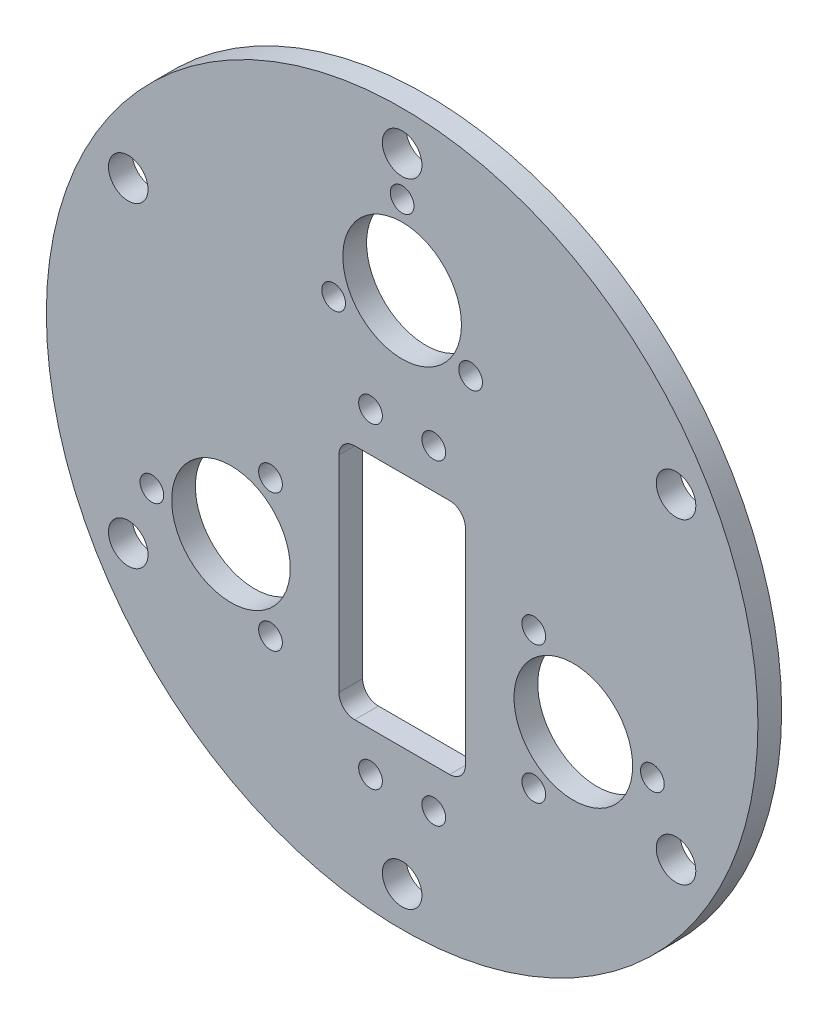
ISO-10303-21;
HEADER;
FILE_DESCRIPTION(('STEP AP214'),'2;1');
FILE_NAME('part.step','',(''),(''),'','','');
FILE_SCHEMA(('AUTOMOTIVE_DESIGN { 1 0 10303 214 1 1 1 1 }'));
ENDSEC;
DATA;
#1=APPLICATION_CONTEXT('core data for automotive mechanical design processes');
#2=APPLICATION_PROTOCOL_DEFINITION('international standard','automotive_design',2000,#1);
#3=PRODUCT_CONTEXT('',#1,'mechanical');
#4=PRODUCT('Part','Part','',(#3));
#5=PRODUCT_RELATED_PRODUCT_CATEGORY('part','',(#4));
#6=PRODUCT_DEFINITION_FORMATION('','',#4);
#7=PRODUCT_DEFINITION_CONTEXT('part definition',#1,'design');
#8=PRODUCT_DEFINITION('design','',#6,#7);
#9=PRODUCT_DEFINITION_SHAPE('','',#8);
#10=(LENGTH_UNIT() NAMED_UNIT(*) SI_UNIT(.MILLI.,.METRE.));
#11=(NAMED_UNIT(*) PLANE_ANGLE_UNIT() SI_UNIT($,.RADIAN.));
#12=(NAMED_UNIT(*) SI_UNIT($,.STERADIAN.) SOLID_ANGLE_UNIT());
#13=UNCERTAINTY_MEASURE_WITH_UNIT(LENGTH_MEASURE(1.E-05),#10,'distance_accuracy_value','');
#14=(GEOMETRIC_REPRESENTATION_CONTEXT(3) GLOBAL_UNCERTAINTY_ASSIGNED_CONTEXT((#13)) GLOBAL_UNIT_ASSIGNED_CONTEXT((#10,
#11,#12)) REPRESENTATION_CONTEXT('',''));
#15=CARTESIAN_POINT('',(0.,0.,0.));
#16=DIRECTION('',(0.,0.,1.));
#17=DIRECTION('',(1.,0.,0.));
#18=AXIS2_PLACEMENT_3D('',#15,#16,#17);
#19=CARTESIAN_POINT('',(0.,0.,0.3));
#20=DIRECTION('',(0.,0.,1.));
#21=DIRECTION('',(1.,0.,0.));
#22=AXIS2_PLACEMENT_3D('',#19,#20,#21);
#23=PLANE('',#22);
#24=CARTESIAN_POINT('',(-0.4,1.,0.3));
#25=DIRECTION('',(0.,0.,1.));
#26=DIRECTION('',(1.,0.,0.));
#27=AXIS2_PLACEMENT_3D('',#24,#25,#26);
#28=CIRCLE('',#27,0.15);
#29=CARTESIAN_POINT('',(-0.25,1.,0.3));
#30=VERTEX_POINT('',#29);
#31=EDGE_CURVE('E384',#30,#30,#28,.T.);
#32=ORIENTED_EDGE('',*,*,#31,.F.);
#33=EDGE_LOOP('',(#32));
#34=FACE_BOUND('',#33,.T.);
#35=CARTESIAN_POINT('',(0.4,1.,0.3));
#36=DIRECTION('',(0.,0.,1.));
#37=DIRECTION('',(1.,0.,0.));
#38=AXIS2_PLACEMENT_3D('',#35,#36,#37);
#39=CIRCLE('',#38,0.15);
#40=CARTESIAN_POINT('',(0.549999999999999,1.,0.3));
#41=VERTEX_POINT('',#40);
#42=EDGE_CURVE('E386',#41,#41,#39,.T.);
#43=ORIENTED_EDGE('',*,*,#42,.F.);
#44=EDGE_LOOP('',(#43));
#45=FACE_BOUND('',#44,.T.);
#46=CARTESIAN_POINT('',(-0.4,-3.,0.3));
#47=DIRECTION('',(0.,0.,1.));
#48=DIRECTION('',(1.,0.,0.));
#49=AXIS2_PLACEMENT_3D('',#46,#47,#48);
#50=CIRCLE('',#49,0.15);
#51=CARTESIAN_POINT('',(-0.25,-3.,0.3));
#52=VERTEX_POINT('',#51);
#53=EDGE_CURVE('E392',#52,#52,#50,.T.);
#54=ORIENTED_EDGE('',*,*,#53,.F.);
#55=EDGE_LOOP('',(#54));
#56=FACE_BOUND('',#55,.T.);
#57=CARTESIAN_POINT('',(0.4,-3.,0.3));
#58=DIRECTION('',(0.,0.,1.));
#59=DIRECTION('',(1.,0.,0.));
#60=AXIS2_PLACEMENT_3D('',#57,#58,#59);
#61=CIRCLE('',#60,0.15);
#62=CARTESIAN_POINT('',(0.55,-3.,0.3));
#63=VERTEX_POINT('',#62);
#64=EDGE_CURVE('E398',#63,#63,#61,.T.);
#65=ORIENTED_EDGE('',*,*,#64,.F.);
#66=EDGE_LOOP('',(#65));
#67=FACE_BOUND('',#66,.T.);
#68=CARTESIAN_POINT('',(-1.66506350946094,-0.383974596215649,0.3));
#69=DIRECTION('',(0.,0.,1.));
#70=DIRECTION('',(-0.499999999999992,-0.866025403784443,0.));
#71=AXIS2_PLACEMENT_3D('',#68,#69,#70);
#72=CIRCLE('',#71,0.15);
#73=CARTESIAN_POINT('',(-1.74006350946094,-0.513878406783316,0.3));
#74=VERTEX_POINT('',#73);
#75=EDGE_CURVE('E404',#74,#74,#72,.T.);
#76=ORIENTED_EDGE('',*,*,#75,.F.);
#77=EDGE_LOOP('',(#76));
#78=FACE_BOUND('',#77,.T.);
#79=CARTESIAN_POINT('',(-1.66506350946093,-2.11602540378453,0.3));
#80=DIRECTION('',(0.,0.,1.));
#81=DIRECTION('',(-0.500000000000004,0.866025403784436,0.));
#82=AXIS2_PLACEMENT_3D('',#79,#80,#81);
#83=CIRCLE('',#82,0.15);
#84=CARTESIAN_POINT('',(-1.74006350946093,-1.98612159321686,0.3));
#85=VERTEX_POINT('',#84);
#86=EDGE_CURVE('E410',#85,#85,#83,.T.);
#87=ORIENTED_EDGE('',*,*,#86,.F.);
#88=EDGE_LOOP('',(#87));
#89=FACE_BOUND('',#88,.T.);
#90=CARTESIAN_POINT('',(-3.16506350946094,-1.25000000000009,0.3));
#91=DIRECTION('',(0.,0.,1.));
#92=DIRECTION('',(1.,0.,0.));
#93=AXIS2_PLACEMENT_3D('',#90,#91,#92);
#94=CIRCLE('',#93,0.15);
#95=CARTESIAN_POINT('',(-3.01506350946094,-1.25000000000009,0.3));
#96=VERTEX_POINT('',#95);
#97=EDGE_CURVE('E416',#96,#96,#94,.T.);
#98=ORIENTED_EDGE('',*,*,#97,.F.);
#99=EDGE_LOOP('',(#98));
#100=FACE_BOUND('',#99,.T.);
#101=CARTESIAN_POINT('',(1.66506350946127,-2.11602540378435,0.3));
#102=DIRECTION('',(0.,0.,1.));
#103=DIRECTION('',(-0.499999999999992,-0.866025403784443,0.));
#104=AXIS2_PLACEMENT_3D('',#101,#102,#103);
#105=CIRCLE('',#104,0.15);
#106=CARTESIAN_POINT('',(1.59006350946127,-2.24592921435202,0.3));
#107=VERTEX_POINT('',#106);
#108=EDGE_CURVE('E422',#107,#107,#105,.T.);
#109=ORIENTED_EDGE('',*,*,#108,.F.);
#110=EDGE_LOOP('',(#109));
#111=FACE_BOUND('',#110,.T.);
#112=CARTESIAN_POINT('',(1.66506350946125,-0.383974596215471,0.3));
#113=DIRECTION('',(0.,0.,1.));
#114=DIRECTION('',(-0.500000000000004,0.866025403784436,0.));
#115=AXIS2_PLACEMENT_3D('',#112,#113,#114);
#116=CIRCLE('',#115,0.15);
#117=CARTESIAN_POINT('',(1.59006350946125,-0.254070785647806,0.3));
#118=VERTEX_POINT('',#117);
#119=EDGE_CURVE('E428',#118,#118,#116,.T.);
#120=ORIENTED_EDGE('',*,*,#119,.F.);
#121=EDGE_LOOP('',(#120));
#122=FACE_BOUND('',#121,.T.);
#123=CARTESIAN_POINT('',(3.16506350946126,-1.24999999999991,0.3));
#124=DIRECTION('',(0.,0.,1.));
#125=DIRECTION('',(1.,0.,0.));
#126=AXIS2_PLACEMENT_3D('',#123,#124,#125);
#127=CIRCLE('',#126,0.15);
#128=CARTESIAN_POINT('',(3.31506350946126,-1.24999999999991,0.3));
#129=VERTEX_POINT('',#128);
#130=EDGE_CURVE('E434',#129,#129,#127,.T.);
#131=ORIENTED_EDGE('',*,*,#130,.F.);
#132=EDGE_LOOP('',(#131));
#133=FACE_BOUND('',#132,.T.);
#134=CARTESIAN_POINT('',(0.866025403784441,2.,0.3));
#135=DIRECTION('',(0.,0.,1.));
#136=DIRECTION('',(-0.499999999999997,-0.866025403784441,0.));
#137=AXIS2_PLACEMENT_3D('',#134,#135,#136);
#138=CIRCLE('',#137,0.15);
#139=CARTESIAN_POINT('',(0.791025403784441,1.87009618943234,0.3));
#140=VERTEX_POINT('',#139);
#141=EDGE_CURVE('E440',#140,#140,#138,.T.);
#142=ORIENTED_EDGE('',*,*,#141,.F.);
#143=EDGE_LOOP('',(#142));
#144=FACE_BOUND('',#143,.T.);
#145=CARTESIAN_POINT('',(-0.866025403784438,2.,0.3));
#146=DIRECTION('',(0.,0.,1.));
#147=DIRECTION('',(-0.500000000000002,0.866025403784438,0.));
#148=AXIS2_PLACEMENT_3D('',#145,#146,#147);
#149=CIRCLE('',#148,0.15);
#150=CARTESIAN_POINT('',(-0.941025403784438,2.12990381056766,0.3));
#151=VERTEX_POINT('',#150);
#152=EDGE_CURVE('E446',#151,#151,#149,.T.);
#153=ORIENTED_EDGE('',*,*,#152,.F.);
#154=EDGE_LOOP('',(#153));
#155=FACE_BOUND('',#154,.T.);
#156=CARTESIAN_POINT('',(0.,3.5,0.3));
#157=DIRECTION('',(0.,0.,1.));
#158=DIRECTION('',(1.,0.,0.));
#159=AXIS2_PLACEMENT_3D('',#156,#157,#158);
#160=CIRCLE('',#159,0.15);
#161=CARTESIAN_POINT('',(0.15,3.5,0.3));
#162=VERTEX_POINT('',#161);
#163=EDGE_CURVE('E452',#162,#162,#160,.T.);
#164=ORIENTED_EDGE('',*,*,#163,.F.);
#165=EDGE_LOOP('',(#164));
#166=FACE_BOUND('',#165,.T.);
#167=DIRECTION('',(-1.,0.,0.));
#168=VECTOR('',#167,1.);
#169=CARTESIAN_POINT('',(-0.8,0.5,0.3));
#170=LINE('',#169,#168);
#171=CARTESIAN_POINT('',(0.6,0.5,0.3));
#172=VERTEX_POINT('',#171);
#173=CARTESIAN_POINT('',(-0.6,0.5,0.3));
#174=VERTEX_POINT('',#173);
#175=EDGE_CURVE('E134',#172,#174,#170,.T.);
#176=ORIENTED_EDGE('',*,*,#175,.F.);
#177=CARTESIAN_POINT('',(0.6,0.3,0.3));
#178=DIRECTION('',(0.,0.,1.));
#179=DIRECTION('',(1.,0.,0.));
#180=AXIS2_PLACEMENT_3D('',#177,#178,#179);
#181=CIRCLE('',#180,0.2);
#182=CARTESIAN_POINT('',(0.8,0.3,0.3));
#183=VERTEX_POINT('',#182);
#184=EDGE_CURVE('E215',#172,#183,#181,.F.);
#185=ORIENTED_EDGE('',*,*,#184,.T.);
#186=DIRECTION('',(0.,1.,0.));
#187=VECTOR('',#186,1.);
#188=CARTESIAN_POINT('',(0.8,0.5,0.3));
#189=LINE('',#188,#187);
#190=CARTESIAN_POINT('',(0.8,-2.3,0.3));
#191=VERTEX_POINT('',#190);
#192=EDGE_CURVE('E128',#191,#183,#189,.T.);
#193=ORIENTED_EDGE('',*,*,#192,.F.);
#194=CARTESIAN_POINT('',(0.6,-2.3,0.3));
#195=DIRECTION('',(0.,0.,1.));
#196=DIRECTION('',(1.,0.,0.));
#197=AXIS2_PLACEMENT_3D('',#194,#195,#196);
#198=CIRCLE('',#197,0.2);
#199=CARTESIAN_POINT('',(0.6,-2.5,0.3));
#200=VERTEX_POINT('',#199);
#201=EDGE_CURVE('E127',#191,#200,#198,.F.);
#202=ORIENTED_EDGE('',*,*,#201,.T.);
#203=DIRECTION('',(1.,0.,0.));
#204=VECTOR('',#203,1.);
#205=CARTESIAN_POINT('',(-0.8,-2.5,0.3));
#206=LINE('',#205,#204);
#207=CARTESIAN_POINT('',(-0.6,-2.5,0.3));
#208=VERTEX_POINT('',#207);
#209=EDGE_CURVE('E117',#208,#200,#206,.T.);
#210=ORIENTED_EDGE('',*,*,#209,.F.);
#211=CARTESIAN_POINT('',(-0.6,-2.3,0.3));
#212=DIRECTION('',(0.,0.,1.));
#213=DIRECTION('',(1.,0.,0.));
#214=AXIS2_PLACEMENT_3D('',#211,#212,#213);
#215=CIRCLE('',#214,0.2);
#216=CARTESIAN_POINT('',(-0.8,-2.3,0.3));
#217=VERTEX_POINT('',#216);
#218=EDGE_CURVE('E100',#208,#217,#215,.F.);
#219=ORIENTED_EDGE('',*,*,#218,.T.);
#220=DIRECTION('',(0.,-1.,0.));
#221=VECTOR('',#220,1.);
#222=CARTESIAN_POINT('',(-0.8,0.5,0.3));
#223=LINE('',#222,#221);
#224=CARTESIAN_POINT('',(-0.8,0.3,0.3));
#225=VERTEX_POINT('',#224);
#226=EDGE_CURVE('E129',#225,#217,#223,.T.);
#227=ORIENTED_EDGE('',*,*,#226,.F.);
#228=CARTESIAN_POINT('',(-0.6,0.3,0.3));
#229=DIRECTION('',(0.,0.,1.));
#230=DIRECTION('',(1.,0.,0.));
#231=AXIS2_PLACEMENT_3D('',#228,#229,#230);
#232=CIRCLE('',#231,0.2);
#233=EDGE_CURVE('E42',#225,#174,#232,.F.);
#234=ORIENTED_EDGE('',*,*,#233,.T.);
#235=EDGE_LOOP('',(#176,#185,#193,#202,#210,#219,#227,#234));
#236=FACE_BOUND('',#235,.T.);
#237=CARTESIAN_POINT('',(3.46410161513773,-2.00000000000004,0.3));
#238=DIRECTION('',(0.,0.,1.));
#239=DIRECTION('',(1.,0.,0.));
#240=AXIS2_PLACEMENT_3D('',#237,#238,#239);
#241=CIRCLE('',#240,0.25);
#242=CARTESIAN_POINT('',(3.71410161513773,-2.00000000000004,0.3));
#243=VERTEX_POINT('',#242);
#244=EDGE_CURVE('E142',#243,#243,#241,.T.);
#245=ORIENTED_EDGE('',*,*,#244,.F.);
#246=EDGE_LOOP('',(#245));
#247=FACE_BOUND('',#246,.T.);
#248=CARTESIAN_POINT('',(3.46410161513777,1.99999999999997,0.3));
#249=DIRECTION('',(0.,0.,1.));
#250=DIRECTION('',(1.,0.,0.));
#251=AXIS2_PLACEMENT_3D('',#248,#249,#250);
#252=CIRCLE('',#251,0.25);
#253=CARTESIAN_POINT('',(3.71410161513777,1.99999999999997,0.3));
#254=VERTEX_POINT('',#253);
#255=EDGE_CURVE('E141',#254,#254,#252,.T.);
#256=ORIENTED_EDGE('',*,*,#255,.F.);
#257=EDGE_LOOP('',(#256));
#258=FACE_BOUND('',#257,.T.);
#259=CARTESIAN_POINT('',(0.,4.,0.3));
#260=DIRECTION('',(0.,0.,1.));
#261=DIRECTION('',(1.,0.,0.));
#262=AXIS2_PLACEMENT_3D('',#259,#260,#261);
#263=CIRCLE('',#262,0.25);
#264=CARTESIAN_POINT('',(0.250000000000028,4.,0.3));
#265=VERTEX_POINT('',#264);
#266=EDGE_CURVE('E149',#265,#265,#263,.T.);
#267=ORIENTED_EDGE('',*,*,#266,.F.);
#268=EDGE_LOOP('',(#267));
#269=FACE_BOUND('',#268,.T.);
#270=CARTESIAN_POINT('',(-3.46410161513775,2.00000000000002,0.3));
#271=DIRECTION('',(0.,0.,1.));
#272=DIRECTION('',(1.,0.,0.));
#273=AXIS2_PLACEMENT_3D('',#270,#271,#272);
#274=CIRCLE('',#273,0.25);
#275=CARTESIAN_POINT('',(-3.21410161513775,2.00000000000002,0.3));
#276=VERTEX_POINT('',#275);
#277=EDGE_CURVE('E155',#276,#276,#274,.T.);
#278=ORIENTED_EDGE('',*,*,#277,.F.);
#279=EDGE_LOOP('',(#278));
#280=FACE_BOUND('',#279,.T.);
#281=CARTESIAN_POINT('',(-3.46410161513776,-1.99999999999999,0.3));
#282=DIRECTION('',(0.,0.,1.));
#283=DIRECTION('',(1.,0.,0.));
#284=AXIS2_PLACEMENT_3D('',#281,#282,#283);
#285=CIRCLE('',#284,0.25);
#286=CARTESIAN_POINT('',(-3.21410161513776,-1.99999999999999,0.3));
#287=VERTEX_POINT('',#286);
#288=EDGE_CURVE('E161',#287,#287,#285,.T.);
#289=ORIENTED_EDGE('',*,*,#288,.F.);
#290=EDGE_LOOP('',(#289));
#291=FACE_BOUND('',#290,.T.);
#292=CARTESIAN_POINT('',(0.,-4.,0.3));
#293=DIRECTION('',(0.,0.,1.));
#294=DIRECTION('',(1.,0.,0.));
#295=AXIS2_PLACEMENT_3D('',#292,#293,#294);
#296=CIRCLE('',#295,0.25);
#297=CARTESIAN_POINT('',(0.25,-4.,0.3));
#298=VERTEX_POINT('',#297);
#299=EDGE_CURVE('E167',#298,#298,#296,.T.);
#300=ORIENTED_EDGE('',*,*,#299,.F.);
#301=EDGE_LOOP('',(#300));
#302=FACE_BOUND('',#301,.T.);
#303=CARTESIAN_POINT('',(2.16506350946126,-1.24999999999991,0.3));
#304=DIRECTION('',(0.,0.,1.));
#305=DIRECTION('',(1.,0.,0.));
#306=AXIS2_PLACEMENT_3D('',#303,#304,#305);
#307=CIRCLE('',#306,0.750000000000137);
#308=CARTESIAN_POINT('',(2.91506350946139,-1.24999999999991,0.3));
#309=VERTEX_POINT('',#308);
#310=EDGE_CURVE('E182',#309,#309,#307,.T.);
#311=ORIENTED_EDGE('',*,*,#310,.F.);
#312=EDGE_LOOP('',(#311));
#313=FACE_BOUND('',#312,.T.);
#314=CARTESIAN_POINT('',(0.,0.,0.3));
#315=DIRECTION('',(0.,0.,1.));
#316=DIRECTION('',(1.,0.,0.));
#317=AXIS2_PLACEMENT_3D('',#314,#315,#316);
#318=CIRCLE('',#317,4.5);
#319=CARTESIAN_POINT('',(4.5,0.,0.3));
#320=VERTEX_POINT('',#319);
#321=EDGE_CURVE('E194',#320,#320,#318,.T.);
#322=ORIENTED_EDGE('',*,*,#321,.T.);
#323=EDGE_LOOP('',(#322));
#324=FACE_BOUND('',#323,.T.);
#325=CARTESIAN_POINT('',(0.,2.5,0.3));
#326=DIRECTION('',(0.,0.,1.));
#327=DIRECTION('',(1.,0.,0.));
#328=AXIS2_PLACEMENT_3D('',#325,#326,#327);
#329=CIRCLE('',#328,0.75);
#330=CARTESIAN_POINT('',(0.75,2.5,0.3));
#331=VERTEX_POINT('',#330);
#332=EDGE_CURVE('E188',#331,#331,#329,.T.);
#333=ORIENTED_EDGE('',*,*,#332,.F.);
#334=EDGE_LOOP('',(#333));
#335=FACE_BOUND('',#334,.T.);
#336=CARTESIAN_POINT('',(-2.16506350946094,-1.25000000000009,0.3));
#337=DIRECTION('',(0.,0.,1.));
#338=DIRECTION('',(1.,0.,0.));
#339=AXIS2_PLACEMENT_3D('',#336,#337,#338);
#340=CIRCLE('',#339,0.750000000000202);
#341=CARTESIAN_POINT('',(-1.41506350946073,-1.25000000000009,0.3));
#342=VERTEX_POINT('',#341);
#343=EDGE_CURVE('E176',#342,#342,#340,.T.);
#344=ORIENTED_EDGE('',*,*,#343,.F.);
#345=EDGE_LOOP('',(#344));
#346=FACE_BOUND('',#345,.T.);
#347=ADVANCED_FACE('F34',(#34,#45,#56,#67,#78,#89,#100,#111,#122,#133,#144,#155,#166,#236,#247,
#258,#269,#280,#291,#302,#313,#324,#335,#346),#23,.T.);
#348=CARTESIAN_POINT('',(0.,0.,0.));
#349=DIRECTION('',(0.,0.,1.));
#350=DIRECTION('',(1.,0.,0.));
#351=AXIS2_PLACEMENT_3D('',#348,#349,#350);
#352=PLANE('',#351);
#353=CARTESIAN_POINT('',(-0.4,1.,0.));
#354=DIRECTION('',(0.,0.,1.));
#355=DIRECTION('',(1.,0.,0.));
#356=AXIS2_PLACEMENT_3D('',#353,#354,#355);
#357=CIRCLE('',#356,0.15);
#358=CARTESIAN_POINT('',(-0.25,1.,0.));
#359=VERTEX_POINT('',#358);
#360=EDGE_CURVE('E382',#359,#359,#357,.T.);
#361=ORIENTED_EDGE('',*,*,#360,.T.);
#362=EDGE_LOOP('',(#361));
#363=FACE_BOUND('',#362,.T.);
#364=CARTESIAN_POINT('',(0.4,1.,0.));
#365=DIRECTION('',(0.,0.,1.));
#366=DIRECTION('',(1.,0.,0.));
#367=AXIS2_PLACEMENT_3D('',#364,#365,#366);
#368=CIRCLE('',#367,0.15);
#369=CARTESIAN_POINT('',(0.549999999999999,1.,0.));
#370=VERTEX_POINT('',#369);
#371=EDGE_CURVE('E389',#370,#370,#368,.T.);
#372=ORIENTED_EDGE('',*,*,#371,.T.);
#373=EDGE_LOOP('',(#372));
#374=FACE_BOUND('',#373,.T.);
#375=CARTESIAN_POINT('',(-0.4,-3.,0.));
#376=DIRECTION('',(0.,0.,1.));
#377=DIRECTION('',(1.,0.,0.));
#378=AXIS2_PLACEMENT_3D('',#375,#376,#377);
#379=CIRCLE('',#378,0.15);
#380=CARTESIAN_POINT('',(-0.25,-3.,0.));
#381=VERTEX_POINT('',#380);
#382=EDGE_CURVE('E395',#381,#381,#379,.T.);
#383=ORIENTED_EDGE('',*,*,#382,.T.);
#384=EDGE_LOOP('',(#383));
#385=FACE_BOUND('',#384,.T.);
#386=CARTESIAN_POINT('',(0.4,-3.,0.));
#387=DIRECTION('',(0.,0.,1.));
#388=DIRECTION('',(1.,0.,0.));
#389=AXIS2_PLACEMENT_3D('',#386,#387,#388);
#390=CIRCLE('',#389,0.15);
#391=CARTESIAN_POINT('',(0.55,-3.,0.));
#392=VERTEX_POINT('',#391);
#393=EDGE_CURVE('E401',#392,#392,#390,.T.);
#394=ORIENTED_EDGE('',*,*,#393,.T.);
#395=EDGE_LOOP('',(#394));
#396=FACE_BOUND('',#395,.T.);
#397=CARTESIAN_POINT('',(-1.66506350946094,-0.383974596215649,0.));
#398=DIRECTION('',(0.,0.,1.));
#399=DIRECTION('',(-0.499999999999992,-0.866025403784443,0.));
#400=AXIS2_PLACEMENT_3D('',#397,#398,#399);
#401=CIRCLE('',#400,0.15);
#402=CARTESIAN_POINT('',(-1.74006350946094,-0.513878406783316,0.));
#403=VERTEX_POINT('',#402);
#404=EDGE_CURVE('E407',#403,#403,#401,.T.);
#405=ORIENTED_EDGE('',*,*,#404,.T.);
#406=EDGE_LOOP('',(#405));
#407=FACE_BOUND('',#406,.T.);
#408=CARTESIAN_POINT('',(-1.66506350946093,-2.11602540378453,0.));
#409=DIRECTION('',(0.,0.,1.));
#410=DIRECTION('',(-0.500000000000004,0.866025403784436,0.));
#411=AXIS2_PLACEMENT_3D('',#408,#409,#410);
#412=CIRCLE('',#411,0.15);
#413=CARTESIAN_POINT('',(-1.74006350946093,-1.98612159321686,0.));
#414=VERTEX_POINT('',#413);
#415=EDGE_CURVE('E413',#414,#414,#412,.T.);
#416=ORIENTED_EDGE('',*,*,#415,.T.);
#417=EDGE_LOOP('',(#416));
#418=FACE_BOUND('',#417,.T.);
#419=CARTESIAN_POINT('',(-3.16506350946094,-1.25000000000009,0.));
#420=DIRECTION('',(0.,0.,1.));
#421=DIRECTION('',(1.,0.,0.));
#422=AXIS2_PLACEMENT_3D('',#419,#420,#421);
#423=CIRCLE('',#422,0.15);
#424=CARTESIAN_POINT('',(-3.01506350946094,-1.25000000000009,0.));
#425=VERTEX_POINT('',#424);
#426=EDGE_CURVE('E419',#425,#425,#423,.T.);
#427=ORIENTED_EDGE('',*,*,#426,.T.);
#428=EDGE_LOOP('',(#427));
#429=FACE_BOUND('',#428,.T.);
#430=CARTESIAN_POINT('',(1.66506350946127,-2.11602540378435,0.));
#431=DIRECTION('',(0.,0.,1.));
#432=DIRECTION('',(-0.499999999999992,-0.866025403784443,0.));
#433=AXIS2_PLACEMENT_3D('',#430,#431,#432);
#434=CIRCLE('',#433,0.15);
#435=CARTESIAN_POINT('',(1.59006350946127,-2.24592921435202,0.));
#436=VERTEX_POINT('',#435);
#437=EDGE_CURVE('E425',#436,#436,#434,.T.);
#438=ORIENTED_EDGE('',*,*,#437,.T.);
#439=EDGE_LOOP('',(#438));
#440=FACE_BOUND('',#439,.T.);
#441=CARTESIAN_POINT('',(1.66506350946125,-0.383974596215471,0.));
#442=DIRECTION('',(0.,0.,1.));
#443=DIRECTION('',(-0.500000000000004,0.866025403784436,0.));
#444=AXIS2_PLACEMENT_3D('',#441,#442,#443);
#445=CIRCLE('',#444,0.15);
#446=CARTESIAN_POINT('',(1.59006350946125,-0.254070785647806,0.));
#447=VERTEX_POINT('',#446);
#448=EDGE_CURVE('E431',#447,#447,#445,.T.);
#449=ORIENTED_EDGE('',*,*,#448,.T.);
#450=EDGE_LOOP('',(#449));
#451=FACE_BOUND('',#450,.T.);
#452=CARTESIAN_POINT('',(3.16506350946126,-1.24999999999991,0.));
#453=DIRECTION('',(0.,0.,1.));
#454=DIRECTION('',(1.,0.,0.));
#455=AXIS2_PLACEMENT_3D('',#452,#453,#454);
#456=CIRCLE('',#455,0.15);
#457=CARTESIAN_POINT('',(3.31506350946126,-1.24999999999991,0.));
#458=VERTEX_POINT('',#457);
#459=EDGE_CURVE('E437',#458,#458,#456,.T.);
#460=ORIENTED_EDGE('',*,*,#459,.T.);
#461=EDGE_LOOP('',(#460));
#462=FACE_BOUND('',#461,.T.);
#463=CARTESIAN_POINT('',(0.866025403784441,2.,0.));
#464=DIRECTION('',(0.,0.,1.));
#465=DIRECTION('',(-0.499999999999997,-0.866025403784441,0.));
#466=AXIS2_PLACEMENT_3D('',#463,#464,#465);
#467=CIRCLE('',#466,0.15);
#468=CARTESIAN_POINT('',(0.791025403784441,1.87009618943234,0.));
#469=VERTEX_POINT('',#468);
#470=EDGE_CURVE('E443',#469,#469,#467,.T.);
#471=ORIENTED_EDGE('',*,*,#470,.T.);
#472=EDGE_LOOP('',(#471));
#473=FACE_BOUND('',#472,.T.);
#474=CARTESIAN_POINT('',(-0.866025403784438,2.,0.));
#475=DIRECTION('',(0.,0.,1.));
#476=DIRECTION('',(-0.500000000000002,0.866025403784438,0.));
#477=AXIS2_PLACEMENT_3D('',#474,#475,#476);
#478=CIRCLE('',#477,0.15);
#479=CARTESIAN_POINT('',(-0.941025403784438,2.12990381056766,0.));
#480=VERTEX_POINT('',#479);
#481=EDGE_CURVE('E449',#480,#480,#478,.T.);
#482=ORIENTED_EDGE('',*,*,#481,.T.);
#483=EDGE_LOOP('',(#482));
#484=FACE_BOUND('',#483,.T.);
#485=CARTESIAN_POINT('',(0.,3.5,0.));
#486=DIRECTION('',(0.,0.,1.));
#487=DIRECTION('',(1.,0.,0.));
#488=AXIS2_PLACEMENT_3D('',#485,#486,#487);
#489=CIRCLE('',#488,0.15);
#490=CARTESIAN_POINT('',(0.15,3.5,0.));
#491=VERTEX_POINT('',#490);
#492=EDGE_CURVE('E221',#491,#491,#489,.T.);
#493=ORIENTED_EDGE('',*,*,#492,.T.);
#494=EDGE_LOOP('',(#493));
#495=FACE_BOUND('',#494,.T.);
#496=DIRECTION('',(1.,0.,0.));
#497=VECTOR('',#496,1.);
#498=CARTESIAN_POINT('',(-0.8,-2.5,0.));
#499=LINE('',#498,#497);
#500=CARTESIAN_POINT('',(-0.6,-2.5,0.));
#501=VERTEX_POINT('',#500);
#502=CARTESIAN_POINT('',(0.6,-2.5,0.));
#503=VERTEX_POINT('',#502);
#504=EDGE_CURVE('E120',#501,#503,#499,.T.);
#505=ORIENTED_EDGE('',*,*,#504,.T.);
#506=CARTESIAN_POINT('',(0.6,-2.3,0.));
#507=DIRECTION('',(0.,0.,1.));
#508=DIRECTION('',(1.,0.,0.));
#509=AXIS2_PLACEMENT_3D('',#506,#507,#508);
#510=CIRCLE('',#509,0.2);
#511=CARTESIAN_POINT('',(0.8,-2.3,0.));
#512=VERTEX_POINT('',#511);
#513=EDGE_CURVE('E213',#503,#512,#510,.T.);
#514=ORIENTED_EDGE('',*,*,#513,.T.);
#515=DIRECTION('',(0.,1.,0.));
#516=VECTOR('',#515,1.);
#517=CARTESIAN_POINT('',(0.8,0.5,0.));
#518=LINE('',#517,#516);
#519=CARTESIAN_POINT('',(0.8,0.3,0.));
#520=VERTEX_POINT('',#519);
#521=EDGE_CURVE('E145',#512,#520,#518,.T.);
#522=ORIENTED_EDGE('',*,*,#521,.T.);
#523=CARTESIAN_POINT('',(0.6,0.3,0.));
#524=DIRECTION('',(0.,0.,1.));
#525=DIRECTION('',(1.,0.,0.));
#526=AXIS2_PLACEMENT_3D('',#523,#524,#525);
#527=CIRCLE('',#526,0.2);
#528=CARTESIAN_POINT('',(0.6,0.5,0.));
#529=VERTEX_POINT('',#528);
#530=EDGE_CURVE('E56',#520,#529,#527,.T.);
#531=ORIENTED_EDGE('',*,*,#530,.T.);
#532=DIRECTION('',(-1.,0.,0.));
#533=VECTOR('',#532,1.);
#534=CARTESIAN_POINT('',(-0.8,0.5,0.));
#535=LINE('',#534,#533);
#536=CARTESIAN_POINT('',(-0.6,0.5,0.));
#537=VERTEX_POINT('',#536);
#538=EDGE_CURVE('E132',#529,#537,#535,.T.);
#539=ORIENTED_EDGE('',*,*,#538,.T.);
#540=CARTESIAN_POINT('',(-0.6,0.3,0.));
#541=DIRECTION('',(0.,0.,1.));
#542=DIRECTION('',(1.,0.,0.));
#543=AXIS2_PLACEMENT_3D('',#540,#541,#542);
#544=CIRCLE('',#543,0.2);
#545=CARTESIAN_POINT('',(-0.8,0.3,0.));
#546=VERTEX_POINT('',#545);
#547=EDGE_CURVE('E11',#537,#546,#544,.T.);
#548=ORIENTED_EDGE('',*,*,#547,.T.);
#549=DIRECTION('',(0.,-1.,0.));
#550=VECTOR('',#549,1.);
#551=CARTESIAN_POINT('',(-0.8,0.5,0.));
#552=LINE('',#551,#550);
#553=CARTESIAN_POINT('',(-0.8,-2.3,0.));
#554=VERTEX_POINT('',#553);
#555=EDGE_CURVE('E227',#546,#554,#552,.T.);
#556=ORIENTED_EDGE('',*,*,#555,.T.);
#557=CARTESIAN_POINT('',(-0.6,-2.3,0.));
#558=DIRECTION('',(0.,0.,1.));
#559=DIRECTION('',(1.,0.,0.));
#560=AXIS2_PLACEMENT_3D('',#557,#558,#559);
#561=CIRCLE('',#560,0.2);
#562=EDGE_CURVE('E110',#554,#501,#561,.T.);
#563=ORIENTED_EDGE('',*,*,#562,.T.);
#564=EDGE_LOOP('',(#505,#514,#522,#531,#539,#548,#556,#563));
#565=FACE_BOUND('',#564,.T.);
#566=CARTESIAN_POINT('',(3.46410161513773,-2.00000000000004,0.));
#567=DIRECTION('',(0.,0.,1.));
#568=DIRECTION('',(1.,0.,0.));
#569=AXIS2_PLACEMENT_3D('',#566,#567,#568);
#570=CIRCLE('',#569,0.25);
#571=CARTESIAN_POINT('',(3.71410161513773,-2.00000000000004,0.));
#572=VERTEX_POINT('',#571);
#573=EDGE_CURVE('E138',#572,#572,#570,.T.);
#574=ORIENTED_EDGE('',*,*,#573,.T.);
#575=EDGE_LOOP('',(#574));
#576=FACE_BOUND('',#575,.T.);
#577=CARTESIAN_POINT('',(3.46410161513777,1.99999999999997,0.));
#578=DIRECTION('',(0.,0.,1.));
#579=DIRECTION('',(1.,0.,0.));
#580=AXIS2_PLACEMENT_3D('',#577,#578,#579);
#581=CIRCLE('',#580,0.25);
#582=CARTESIAN_POINT('',(3.71410161513777,1.99999999999997,0.));
#583=VERTEX_POINT('',#582);
#584=EDGE_CURVE('E146',#583,#583,#581,.T.);
#585=ORIENTED_EDGE('',*,*,#584,.T.);
#586=EDGE_LOOP('',(#585));
#587=FACE_BOUND('',#586,.T.);
#588=CARTESIAN_POINT('',(0.,4.,0.));
#589=DIRECTION('',(0.,0.,1.));
#590=DIRECTION('',(1.,0.,0.));
#591=AXIS2_PLACEMENT_3D('',#588,#589,#590);
#592=CIRCLE('',#591,0.25);
#593=CARTESIAN_POINT('',(0.250000000000028,4.,0.));
#594=VERTEX_POINT('',#593);
#595=EDGE_CURVE('E152',#594,#594,#592,.T.);
#596=ORIENTED_EDGE('',*,*,#595,.T.);
#597=EDGE_LOOP('',(#596));
#598=FACE_BOUND('',#597,.T.);
#599=CARTESIAN_POINT('',(-3.46410161513775,2.00000000000002,0.));
#600=DIRECTION('',(0.,0.,1.));
#601=DIRECTION('',(1.,0.,0.));
#602=AXIS2_PLACEMENT_3D('',#599,#600,#601);
#603=CIRCLE('',#602,0.25);
#604=CARTESIAN_POINT('',(-3.21410161513775,2.00000000000002,0.));
#605=VERTEX_POINT('',#604);
#606=EDGE_CURVE('E158',#605,#605,#603,.T.);
#607=ORIENTED_EDGE('',*,*,#606,.T.);
#608=EDGE_LOOP('',(#607));
#609=FACE_BOUND('',#608,.T.);
#610=CARTESIAN_POINT('',(-3.46410161513776,-1.99999999999999,0.));
#611=DIRECTION('',(0.,0.,1.));
#612=DIRECTION('',(1.,0.,0.));
#613=AXIS2_PLACEMENT_3D('',#610,#611,#612);
#614=CIRCLE('',#613,0.25);
#615=CARTESIAN_POINT('',(-3.21410161513776,-1.99999999999999,0.));
#616=VERTEX_POINT('',#615);
#617=EDGE_CURVE('E164',#616,#616,#614,.T.);
#618=ORIENTED_EDGE('',*,*,#617,.T.);
#619=EDGE_LOOP('',(#618));
#620=FACE_BOUND('',#619,.T.);
#621=CARTESIAN_POINT('',(0.,-4.,0.));
#622=DIRECTION('',(0.,0.,1.));
#623=DIRECTION('',(1.,0.,0.));
#624=AXIS2_PLACEMENT_3D('',#621,#622,#623);
#625=CIRCLE('',#624,0.25);
#626=CARTESIAN_POINT('',(0.25,-4.,0.));
#627=VERTEX_POINT('',#626);
#628=EDGE_CURVE('E170',#627,#627,#625,.T.);
#629=ORIENTED_EDGE('',*,*,#628,.T.);
#630=EDGE_LOOP('',(#629));
#631=FACE_BOUND('',#630,.T.);
#632=CARTESIAN_POINT('',(2.16506350946126,-1.24999999999991,0.));
#633=DIRECTION('',(0.,0.,1.));
#634=DIRECTION('',(1.,0.,0.));
#635=AXIS2_PLACEMENT_3D('',#632,#633,#634);
#636=CIRCLE('',#635,0.750000000000137);
#637=CARTESIAN_POINT('',(2.91506350946139,-1.24999999999991,0.));
#638=VERTEX_POINT('',#637);
#639=EDGE_CURVE('E179',#638,#638,#636,.T.);
#640=ORIENTED_EDGE('',*,*,#639,.T.);
#641=EDGE_LOOP('',(#640));
#642=FACE_BOUND('',#641,.T.);
#643=CARTESIAN_POINT('',(0.,0.,0.));
#644=DIRECTION('',(0.,0.,1.));
#645=DIRECTION('',(1.,0.,0.));
#646=AXIS2_PLACEMENT_3D('',#643,#644,#645);
#647=CIRCLE('',#646,4.5);
#648=CARTESIAN_POINT('',(4.5,0.,0.));
#649=VERTEX_POINT('',#648);
#650=EDGE_CURVE('E191',#649,#649,#647,.T.);
#651=ORIENTED_EDGE('',*,*,#650,.F.);
#652=EDGE_LOOP('',(#651));
#653=FACE_BOUND('',#652,.T.);
#654=CARTESIAN_POINT('',(0.,2.5,0.));
#655=DIRECTION('',(0.,0.,1.));
#656=DIRECTION('',(1.,0.,0.));
#657=AXIS2_PLACEMENT_3D('',#654,#655,#656);
#658=CIRCLE('',#657,0.75);
#659=CARTESIAN_POINT('',(0.75,2.5,0.));
#660=VERTEX_POINT('',#659);
#661=EDGE_CURVE('E185',#660,#660,#658,.T.);
#662=ORIENTED_EDGE('',*,*,#661,.T.);
#663=EDGE_LOOP('',(#662));
#664=FACE_BOUND('',#663,.T.);
#665=CARTESIAN_POINT('',(-2.16506350946094,-1.25000000000009,0.));
#666=DIRECTION('',(0.,0.,1.));
#667=DIRECTION('',(1.,0.,0.));
#668=AXIS2_PLACEMENT_3D('',#665,#666,#667);
#669=CIRCLE('',#668,0.750000000000202);
#670=CARTESIAN_POINT('',(-1.41506350946073,-1.25000000000009,0.));
#671=VERTEX_POINT('',#670);
#672=EDGE_CURVE('E173',#671,#671,#669,.T.);
#673=ORIENTED_EDGE('',*,*,#672,.T.);
#674=EDGE_LOOP('',(#673));
#675=FACE_BOUND('',#674,.T.);
#676=ADVANCED_FACE('F225',(#363,#374,#385,#396,#407,#418,#429,#440,#451,#462,#473,#484,#495,
#565,#576,#587,#598,#609,#620,#631,#642,#653,#664,#675),#352,.F.);
#677=CARTESIAN_POINT('',(0.,0.,0.3));
#678=DIRECTION('',(0.,0.,-1.));
#679=DIRECTION('',(-1.,0.,0.));
#680=AXIS2_PLACEMENT_3D('',#677,#678,#679);
#681=CYLINDRICAL_SURFACE('',#680,4.5);
#682=ORIENTED_EDGE('',*,*,#321,.F.);
#683=EDGE_LOOP('',(#682));
#684=FACE_BOUND('',#683,.T.);
#685=ORIENTED_EDGE('',*,*,#650,.T.);
#686=EDGE_LOOP('',(#685));
#687=FACE_BOUND('',#686,.T.);
#688=ADVANCED_FACE('F259',(#684,#687),#681,.T.);
#689=CARTESIAN_POINT('',(0.,2.5,0.3));
#690=DIRECTION('',(0.,0.,-1.));
#691=DIRECTION('',(-1.,0.,0.));
#692=AXIS2_PLACEMENT_3D('',#689,#690,#691);
#693=CYLINDRICAL_SURFACE('',#692,0.75);
#694=ORIENTED_EDGE('',*,*,#332,.T.);
#695=EDGE_LOOP('',(#694));
#696=FACE_BOUND('',#695,.T.);
#697=ORIENTED_EDGE('',*,*,#661,.F.);
#698=EDGE_LOOP('',(#697));
#699=FACE_BOUND('',#698,.T.);
#700=ADVANCED_FACE('F265',(#696,#699),#693,.F.);
#701=CARTESIAN_POINT('',(2.16506350946126,-1.24999999999991,0.3));
#702=DIRECTION('',(0.,0.,-1.));
#703=DIRECTION('',(-1.,0.,0.));
#704=AXIS2_PLACEMENT_3D('',#701,#702,#703);
#705=CYLINDRICAL_SURFACE('',#704,0.750000000000137);
#706=ORIENTED_EDGE('',*,*,#310,.T.);
#707=EDGE_LOOP('',(#706));
#708=FACE_BOUND('',#707,.T.);
#709=ORIENTED_EDGE('',*,*,#639,.F.);
#710=EDGE_LOOP('',(#709));
#711=FACE_BOUND('',#710,.T.);
#712=ADVANCED_FACE('F274',(#708,#711),#705,.F.);
#713=CARTESIAN_POINT('',(-2.16506350946094,-1.25000000000009,0.3));
#714=DIRECTION('',(0.,0.,-1.));
#715=DIRECTION('',(-1.,0.,0.));
#716=AXIS2_PLACEMENT_3D('',#713,#714,#715);
#717=CYLINDRICAL_SURFACE('',#716,0.750000000000202);
#718=ORIENTED_EDGE('',*,*,#343,.T.);
#719=EDGE_LOOP('',(#718));
#720=FACE_BOUND('',#719,.T.);
#721=ORIENTED_EDGE('',*,*,#672,.F.);
#722=EDGE_LOOP('',(#721));
#723=FACE_BOUND('',#722,.T.);
#724=ADVANCED_FACE('F285',(#720,#723),#717,.F.);
#725=CARTESIAN_POINT('',(0.,-4.,0.));
#726=DIRECTION('',(0.,0.,1.));
#727=DIRECTION('',(1.,0.,0.));
#728=AXIS2_PLACEMENT_3D('',#725,#726,#727);
#729=CYLINDRICAL_SURFACE('',#728,0.25);
#730=ORIENTED_EDGE('',*,*,#628,.F.);
#731=EDGE_LOOP('',(#730));
#732=FACE_BOUND('',#731,.T.);
#733=ORIENTED_EDGE('',*,*,#299,.T.);
#734=EDGE_LOOP('',(#733));
#735=FACE_BOUND('',#734,.T.);
#736=ADVANCED_FACE('F287',(#732,#735),#729,.F.);
#737=CARTESIAN_POINT('',(-3.46410161513776,-1.99999999999999,0.));
#738=DIRECTION('',(0.,0.,1.));
#739=DIRECTION('',(1.,0.,0.));
#740=AXIS2_PLACEMENT_3D('',#737,#738,#739);
#741=CYLINDRICAL_SURFACE('',#740,0.25);
#742=ORIENTED_EDGE('',*,*,#617,.F.);
#743=EDGE_LOOP('',(#742));
#744=FACE_BOUND('',#743,.T.);
#745=ORIENTED_EDGE('',*,*,#288,.T.);
#746=EDGE_LOOP('',(#745));
#747=FACE_BOUND('',#746,.T.);
#748=ADVANCED_FACE('F294',(#744,#747),#741,.F.);
#749=CARTESIAN_POINT('',(-3.46410161513775,2.00000000000002,0.));
#750=DIRECTION('',(0.,0.,1.));
#751=DIRECTION('',(1.,0.,0.));
#752=AXIS2_PLACEMENT_3D('',#749,#750,#751);
#753=CYLINDRICAL_SURFACE('',#752,0.25);
#754=ORIENTED_EDGE('',*,*,#606,.F.);
#755=EDGE_LOOP('',(#754));
#756=FACE_BOUND('',#755,.T.);
#757=ORIENTED_EDGE('',*,*,#277,.T.);
#758=EDGE_LOOP('',(#757));
#759=FACE_BOUND('',#758,.T.);
#760=ADVANCED_FACE('F301',(#756,#759),#753,.F.);
#761=CARTESIAN_POINT('',(0.,4.,0.));
#762=DIRECTION('',(0.,0.,1.));
#763=DIRECTION('',(1.,0.,0.));
#764=AXIS2_PLACEMENT_3D('',#761,#762,#763);
#765=CYLINDRICAL_SURFACE('',#764,0.25);
#766=ORIENTED_EDGE('',*,*,#595,.F.);
#767=EDGE_LOOP('',(#766));
#768=FACE_BOUND('',#767,.T.);
#769=ORIENTED_EDGE('',*,*,#266,.T.);
#770=EDGE_LOOP('',(#769));
#771=FACE_BOUND('',#770,.T.);
#772=ADVANCED_FACE('F305',(#768,#771),#765,.F.);
#773=CARTESIAN_POINT('',(3.46410161513777,1.99999999999997,0.));
#774=DIRECTION('',(0.,0.,1.));
#775=DIRECTION('',(1.,0.,0.));
#776=AXIS2_PLACEMENT_3D('',#773,#774,#775);
#777=CYLINDRICAL_SURFACE('',#776,0.25);
#778=ORIENTED_EDGE('',*,*,#584,.F.);
#779=EDGE_LOOP('',(#778));
#780=FACE_BOUND('',#779,.T.);
#781=ORIENTED_EDGE('',*,*,#255,.T.);
#782=EDGE_LOOP('',(#781));
#783=FACE_BOUND('',#782,.T.);
#784=ADVANCED_FACE('F309',(#780,#783),#777,.F.);
#785=CARTESIAN_POINT('',(3.46410161513773,-2.00000000000004,0.));
#786=DIRECTION('',(0.,0.,1.));
#787=DIRECTION('',(1.,0.,0.));
#788=AXIS2_PLACEMENT_3D('',#785,#786,#787);
#789=CYLINDRICAL_SURFACE('',#788,0.25);
#790=ORIENTED_EDGE('',*,*,#573,.F.);
#791=EDGE_LOOP('',(#790));
#792=FACE_BOUND('',#791,.T.);
#793=ORIENTED_EDGE('',*,*,#244,.T.);
#794=EDGE_LOOP('',(#793));
#795=FACE_BOUND('',#794,.T.);
#796=ADVANCED_FACE('F313',(#792,#795),#789,.F.);
#797=CARTESIAN_POINT('',(-0.8,0.5,0.));
#798=DIRECTION('',(0.,1.,0.));
#799=DIRECTION('',(0.,0.,1.));
#800=AXIS2_PLACEMENT_3D('',#797,#798,#799);
#801=PLANE('',#800);
#802=ORIENTED_EDGE('',*,*,#538,.F.);
#803=DIRECTION('',(0.,0.,1.));
#804=VECTOR('',#803,1.);
#805=CARTESIAN_POINT('',(0.6,0.5,0.3));
#806=LINE('',#805,#804);
#807=EDGE_CURVE('E111',#529,#172,#806,.T.);
#808=ORIENTED_EDGE('',*,*,#807,.T.);
#809=ORIENTED_EDGE('',*,*,#175,.T.);
#810=DIRECTION('',(0.,0.,1.));
#811=VECTOR('',#810,1.);
#812=CARTESIAN_POINT('',(-0.6,0.5,0.));
#813=LINE('',#812,#811);
#814=EDGE_CURVE('E49',#174,#537,#813,.F.);
#815=ORIENTED_EDGE('',*,*,#814,.T.);
#816=EDGE_LOOP('',(#802,#808,#809,#815));
#817=FACE_BOUND('',#816,.T.);
#818=ADVANCED_FACE('F219',(#817),#801,.F.);
#819=CARTESIAN_POINT('',(0.8,0.5,0.));
#820=DIRECTION('',(1.,0.,0.));
#821=DIRECTION('',(0.,0.,-1.));
#822=AXIS2_PLACEMENT_3D('',#819,#820,#821);
#823=PLANE('',#822);
#824=ORIENTED_EDGE('',*,*,#521,.F.);
#825=DIRECTION('',(0.,0.,1.));
#826=VECTOR('',#825,1.);
#827=CARTESIAN_POINT('',(0.8,-2.3,0.3));
#828=LINE('',#827,#826);
#829=EDGE_CURVE('E205',#512,#191,#828,.T.);
#830=ORIENTED_EDGE('',*,*,#829,.T.);
#831=ORIENTED_EDGE('',*,*,#192,.T.);
#832=DIRECTION('',(0.,0.,1.));
#833=VECTOR('',#832,1.);
#834=CARTESIAN_POINT('',(0.8,0.3,0.));
#835=LINE('',#834,#833);
#836=EDGE_CURVE('E203',#183,#520,#835,.F.);
#837=ORIENTED_EDGE('',*,*,#836,.T.);
#838=EDGE_LOOP('',(#824,#830,#831,#837));
#839=FACE_BOUND('',#838,.T.);
#840=ADVANCED_FACE('F242',(#839),#823,.F.);
#841=CARTESIAN_POINT('',(-0.8,-2.5,0.));
#842=DIRECTION('',(0.,-1.,0.));
#843=DIRECTION('',(0.,0.,-1.));
#844=AXIS2_PLACEMENT_3D('',#841,#842,#843);
#845=PLANE('',#844);
#846=ORIENTED_EDGE('',*,*,#504,.F.);
#847=DIRECTION('',(0.,0.,1.));
#848=VECTOR('',#847,1.);
#849=CARTESIAN_POINT('',(-0.6,-2.5,0.3));
#850=LINE('',#849,#848);
#851=EDGE_CURVE('E104',#501,#208,#850,.T.);
#852=ORIENTED_EDGE('',*,*,#851,.T.);
#853=ORIENTED_EDGE('',*,*,#209,.T.);
#854=DIRECTION('',(0.,0.,1.));
#855=VECTOR('',#854,1.);
#856=CARTESIAN_POINT('',(0.6,-2.5,0.));
#857=LINE('',#856,#855);
#858=EDGE_CURVE('E122',#200,#503,#857,.F.);
#859=ORIENTED_EDGE('',*,*,#858,.T.);
#860=EDGE_LOOP('',(#846,#852,#853,#859));
#861=FACE_BOUND('',#860,.T.);
#862=ADVANCED_FACE('F116',(#861),#845,.F.);
#863=CARTESIAN_POINT('',(-0.8,0.5,0.));
#864=DIRECTION('',(-1.,0.,0.));
#865=DIRECTION('',(0.,0.,1.));
#866=AXIS2_PLACEMENT_3D('',#863,#864,#865);
#867=PLANE('',#866);
#868=ORIENTED_EDGE('',*,*,#226,.T.);
#869=DIRECTION('',(0.,0.,1.));
#870=VECTOR('',#869,1.);
#871=CARTESIAN_POINT('',(-0.8,-2.3,0.));
#872=LINE('',#871,#870);
#873=EDGE_CURVE('E105',#217,#554,#872,.F.);
#874=ORIENTED_EDGE('',*,*,#873,.T.);
#875=ORIENTED_EDGE('',*,*,#555,.F.);
#876=DIRECTION('',(0.,0.,1.));
#877=VECTOR('',#876,1.);
#878=CARTESIAN_POINT('',(-0.8,0.3,0.3));
#879=LINE('',#878,#877);
#880=EDGE_CURVE('E121',#546,#225,#879,.T.);
#881=ORIENTED_EDGE('',*,*,#880,.T.);
#882=EDGE_LOOP('',(#868,#874,#875,#881));
#883=FACE_BOUND('',#882,.T.);
#884=ADVANCED_FACE('F229',(#883),#867,.F.);
#885=CARTESIAN_POINT('',(-0.6,-2.3,0.));
#886=DIRECTION('',(0.,0.,-1.));
#887=DIRECTION('',(-1.,0.,0.));
#888=AXIS2_PLACEMENT_3D('',#885,#886,#887);
#889=CYLINDRICAL_SURFACE('',#888,0.2);
#890=ORIENTED_EDGE('',*,*,#562,.F.);
#891=ORIENTED_EDGE('',*,*,#873,.F.);
#892=ORIENTED_EDGE('',*,*,#218,.F.);
#893=ORIENTED_EDGE('',*,*,#851,.F.);
#894=EDGE_LOOP('',(#890,#891,#892,#893));
#895=FACE_BOUND('',#894,.T.);
#896=ADVANCED_FACE('F103',(#895),#889,.F.);
#897=CARTESIAN_POINT('',(0.6,-2.3,0.));
#898=DIRECTION('',(0.,0.,-1.));
#899=DIRECTION('',(-1.,0.,0.));
#900=AXIS2_PLACEMENT_3D('',#897,#898,#899);
#901=CYLINDRICAL_SURFACE('',#900,0.2);
#902=ORIENTED_EDGE('',*,*,#513,.F.);
#903=ORIENTED_EDGE('',*,*,#858,.F.);
#904=ORIENTED_EDGE('',*,*,#201,.F.);
#905=ORIENTED_EDGE('',*,*,#829,.F.);
#906=EDGE_LOOP('',(#902,#903,#904,#905));
#907=FACE_BOUND('',#906,.T.);
#908=ADVANCED_FACE('F244',(#907),#901,.F.);
#909=CARTESIAN_POINT('',(0.6,0.3,0.));
#910=DIRECTION('',(0.,0.,-1.));
#911=DIRECTION('',(-1.,0.,0.));
#912=AXIS2_PLACEMENT_3D('',#909,#910,#911);
#913=CYLINDRICAL_SURFACE('',#912,0.2);
#914=ORIENTED_EDGE('',*,*,#530,.F.);
#915=ORIENTED_EDGE('',*,*,#836,.F.);
#916=ORIENTED_EDGE('',*,*,#184,.F.);
#917=ORIENTED_EDGE('',*,*,#807,.F.);
#918=EDGE_LOOP('',(#914,#915,#916,#917));
#919=FACE_BOUND('',#918,.T.);
#920=ADVANCED_FACE('F241',(#919),#913,.F.);
#921=CARTESIAN_POINT('',(-0.6,0.3,0.));
#922=DIRECTION('',(0.,0.,-1.));
#923=DIRECTION('',(-1.,0.,0.));
#924=AXIS2_PLACEMENT_3D('',#921,#922,#923);
#925=CYLINDRICAL_SURFACE('',#924,0.2);
#926=ORIENTED_EDGE('',*,*,#547,.F.);
#927=ORIENTED_EDGE('',*,*,#814,.F.);
#928=ORIENTED_EDGE('',*,*,#233,.F.);
#929=ORIENTED_EDGE('',*,*,#880,.F.);
#930=EDGE_LOOP('',(#926,#927,#928,#929));
#931=FACE_BOUND('',#930,.T.);
#932=ADVANCED_FACE('F36',(#931),#925,.F.);
#933=CARTESIAN_POINT('',(0.,3.5,0.));
#934=DIRECTION('',(0.,0.,1.));
#935=DIRECTION('',(1.,0.,0.));
#936=AXIS2_PLACEMENT_3D('',#933,#934,#935);
#937=CYLINDRICAL_SURFACE('',#936,0.15);
#938=ORIENTED_EDGE('',*,*,#492,.F.);
#939=EDGE_LOOP('',(#938));
#940=FACE_BOUND('',#939,.T.);
#941=ORIENTED_EDGE('',*,*,#163,.T.);
#942=EDGE_LOOP('',(#941));
#943=FACE_BOUND('',#942,.T.);
#944=ADVANCED_FACE('F326',(#940,#943),#937,.F.);
#945=CARTESIAN_POINT('',(-0.866025403784438,2.,0.));
#946=DIRECTION('',(0.,0.,1.));
#947=DIRECTION('',(1.,0.,0.));
#948=AXIS2_PLACEMENT_3D('',#945,#946,#947);
#949=CYLINDRICAL_SURFACE('',#948,0.15);
#950=ORIENTED_EDGE('',*,*,#481,.F.);
#951=EDGE_LOOP('',(#950));
#952=FACE_BOUND('',#951,.T.);
#953=ORIENTED_EDGE('',*,*,#152,.T.);
#954=EDGE_LOOP('',(#953));
#955=FACE_BOUND('',#954,.T.);
#956=ADVANCED_FACE('F329',(#952,#955),#949,.F.);
#957=CARTESIAN_POINT('',(0.866025403784441,2.,0.));
#958=DIRECTION('',(0.,0.,1.));
#959=DIRECTION('',(1.,0.,0.));
#960=AXIS2_PLACEMENT_3D('',#957,#958,#959);
#961=CYLINDRICAL_SURFACE('',#960,0.15);
#962=ORIENTED_EDGE('',*,*,#470,.F.);
#963=EDGE_LOOP('',(#962));
#964=FACE_BOUND('',#963,.T.);
#965=ORIENTED_EDGE('',*,*,#141,.T.);
#966=EDGE_LOOP('',(#965));
#967=FACE_BOUND('',#966,.T.);
#968=ADVANCED_FACE('F333',(#964,#967),#961,.F.);
#969=CARTESIAN_POINT('',(3.16506350946126,-1.24999999999991,0.));
#970=DIRECTION('',(0.,0.,1.));
#971=DIRECTION('',(1.,0.,0.));
#972=AXIS2_PLACEMENT_3D('',#969,#970,#971);
#973=CYLINDRICAL_SURFACE('',#972,0.15);
#974=ORIENTED_EDGE('',*,*,#459,.F.);
#975=EDGE_LOOP('',(#974));
#976=FACE_BOUND('',#975,.T.);
#977=ORIENTED_EDGE('',*,*,#130,.T.);
#978=EDGE_LOOP('',(#977));
#979=FACE_BOUND('',#978,.T.);
#980=ADVANCED_FACE('F337',(#976,#979),#973,.F.);
#981=CARTESIAN_POINT('',(1.66506350946125,-0.383974596215471,0.));
#982=DIRECTION('',(0.,0.,1.));
#983=DIRECTION('',(1.,0.,0.));
#984=AXIS2_PLACEMENT_3D('',#981,#982,#983);
#985=CYLINDRICAL_SURFACE('',#984,0.15);
#986=ORIENTED_EDGE('',*,*,#448,.F.);
#987=EDGE_LOOP('',(#986));
#988=FACE_BOUND('',#987,.T.);
#989=ORIENTED_EDGE('',*,*,#119,.T.);
#990=EDGE_LOOP('',(#989));
#991=FACE_BOUND('',#990,.T.);
#992=ADVANCED_FACE('F341',(#988,#991),#985,.F.);
#993=CARTESIAN_POINT('',(1.66506350946127,-2.11602540378435,0.));
#994=DIRECTION('',(0.,0.,1.));
#995=DIRECTION('',(1.,0.,0.));
#996=AXIS2_PLACEMENT_3D('',#993,#994,#995);
#997=CYLINDRICAL_SURFACE('',#996,0.15);
#998=ORIENTED_EDGE('',*,*,#437,.F.);
#999=EDGE_LOOP('',(#998));
#1000=FACE_BOUND('',#999,.T.);
#1001=ORIENTED_EDGE('',*,*,#108,.T.);
#1002=EDGE_LOOP('',(#1001));
#1003=FACE_BOUND('',#1002,.T.);
#1004=ADVANCED_FACE('F345',(#1000,#1003),#997,.F.);
#1005=CARTESIAN_POINT('',(-3.16506350946094,-1.25000000000009,0.));
#1006=DIRECTION('',(0.,0.,1.));
#1007=DIRECTION('',(1.,0.,0.));
#1008=AXIS2_PLACEMENT_3D('',#1005,#1006,#1007);
#1009=CYLINDRICAL_SURFACE('',#1008,0.15);
#1010=ORIENTED_EDGE('',*,*,#426,.F.);
#1011=EDGE_LOOP('',(#1010));
#1012=FACE_BOUND('',#1011,.T.);
#1013=ORIENTED_EDGE('',*,*,#97,.T.);
#1014=EDGE_LOOP('',(#1013));
#1015=FACE_BOUND('',#1014,.T.);
#1016=ADVANCED_FACE('F349',(#1012,#1015),#1009,.F.);
#1017=CARTESIAN_POINT('',(-1.66506350946093,-2.11602540378453,0.));
#1018=DIRECTION('',(0.,0.,1.));
#1019=DIRECTION('',(1.,0.,0.));
#1020=AXIS2_PLACEMENT_3D('',#1017,#1018,#1019);
#1021=CYLINDRICAL_SURFACE('',#1020,0.15);
#1022=ORIENTED_EDGE('',*,*,#415,.F.);
#1023=EDGE_LOOP('',(#1022));
#1024=FACE_BOUND('',#1023,.T.);
#1025=ORIENTED_EDGE('',*,*,#86,.T.);
#1026=EDGE_LOOP('',(#1025));
#1027=FACE_BOUND('',#1026,.T.);
#1028=ADVANCED_FACE('F353',(#1024,#1027),#1021,.F.);
#1029=CARTESIAN_POINT('',(-1.66506350946094,-0.383974596215649,0.));
#1030=DIRECTION('',(0.,0.,1.));
#1031=DIRECTION('',(1.,0.,0.));
#1032=AXIS2_PLACEMENT_3D('',#1029,#1030,#1031);
#1033=CYLINDRICAL_SURFACE('',#1032,0.15);
#1034=ORIENTED_EDGE('',*,*,#404,.F.);
#1035=EDGE_LOOP('',(#1034));
#1036=FACE_BOUND('',#1035,.T.);
#1037=ORIENTED_EDGE('',*,*,#75,.T.);
#1038=EDGE_LOOP('',(#1037));
#1039=FACE_BOUND('',#1038,.T.);
#1040=ADVANCED_FACE('F357',(#1036,#1039),#1033,.F.);
#1041=CARTESIAN_POINT('',(0.4,-3.,0.));
#1042=DIRECTION('',(0.,0.,1.));
#1043=DIRECTION('',(1.,0.,0.));
#1044=AXIS2_PLACEMENT_3D('',#1041,#1042,#1043);
#1045=CYLINDRICAL_SURFACE('',#1044,0.15);
#1046=ORIENTED_EDGE('',*,*,#393,.F.);
#1047=EDGE_LOOP('',(#1046));
#1048=FACE_BOUND('',#1047,.T.);
#1049=ORIENTED_EDGE('',*,*,#64,.T.);
#1050=EDGE_LOOP('',(#1049));
#1051=FACE_BOUND('',#1050,.T.);
#1052=ADVANCED_FACE('F361',(#1048,#1051),#1045,.F.);
#1053=CARTESIAN_POINT('',(-0.4,-3.,0.));
#1054=DIRECTION('',(0.,0.,1.));
#1055=DIRECTION('',(1.,0.,0.));
#1056=AXIS2_PLACEMENT_3D('',#1053,#1054,#1055);
#1057=CYLINDRICAL_SURFACE('',#1056,0.15);
#1058=ORIENTED_EDGE('',*,*,#382,.F.);
#1059=EDGE_LOOP('',(#1058));
#1060=FACE_BOUND('',#1059,.T.);
#1061=ORIENTED_EDGE('',*,*,#53,.T.);
#1062=EDGE_LOOP('',(#1061));
#1063=FACE_BOUND('',#1062,.T.);
#1064=ADVANCED_FACE('F365',(#1060,#1063),#1057,.F.);
#1065=CARTESIAN_POINT('',(0.4,1.,0.));
#1066=DIRECTION('',(0.,0.,1.));
#1067=DIRECTION('',(1.,0.,0.));
#1068=AXIS2_PLACEMENT_3D('',#1065,#1066,#1067);
#1069=CYLINDRICAL_SURFACE('',#1068,0.15);
#1070=ORIENTED_EDGE('',*,*,#371,.F.);
#1071=EDGE_LOOP('',(#1070));
#1072=FACE_BOUND('',#1071,.T.);
#1073=ORIENTED_EDGE('',*,*,#42,.T.);
#1074=EDGE_LOOP('',(#1073));
#1075=FACE_BOUND('',#1074,.T.);
#1076=ADVANCED_FACE('F369',(#1072,#1075),#1069,.F.);
#1077=CARTESIAN_POINT('',(-0.4,1.,0.));
#1078=DIRECTION('',(0.,0.,1.));
#1079=DIRECTION('',(1.,0.,0.));
#1080=AXIS2_PLACEMENT_3D('',#1077,#1078,#1079);
#1081=CYLINDRICAL_SURFACE('',#1080,0.15);
#1082=ORIENTED_EDGE('',*,*,#360,.F.);
#1083=EDGE_LOOP('',(#1082));
#1084=FACE_BOUND('',#1083,.T.);
#1085=ORIENTED_EDGE('',*,*,#31,.T.);
#1086=EDGE_LOOP('',(#1085));
#1087=FACE_BOUND('',#1086,.T.);
#1088=ADVANCED_FACE('F373',(#1084,#1087),#1081,.F.);
#1089=CLOSED_SHELL('',(#347,#676,#688,#700,#712,#724,#736,#748,#760,#772,#784,#796,#818,#840,
#862,#884,#896,#908,#920,#932,#944,#956,#968,#980,#992,#1004,#1016,#1028,#1040,#1052,#1064,
#1076,#1088));
#1090=MANIFOLD_SOLID_BREP('B2',#1089);
#1091=ADVANCED_BREP_SHAPE_REPRESENTATION('',(#18,#1090),#14);
#1092=SHAPE_DEFINITION_REPRESENTATION(#9,#1091);
ENDSEC;
END-ISO-10303-21;
